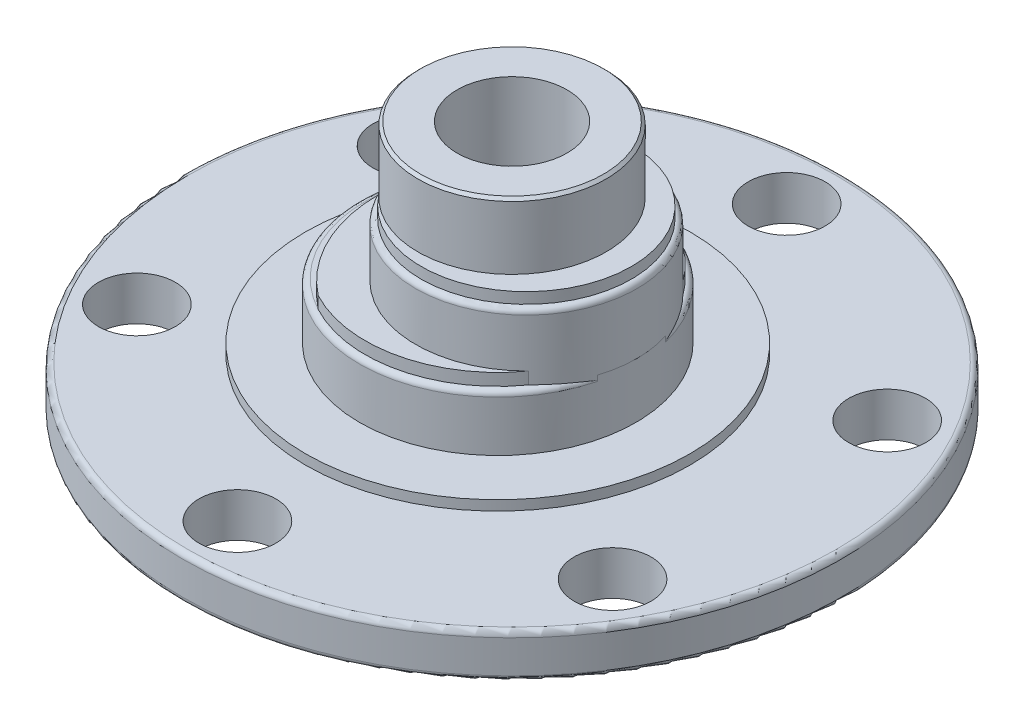
ISO-10303-21;
HEADER;
FILE_DESCRIPTION(('STEP AP214'),'2;1');
FILE_NAME('part.step','',(''),(''),'','','');
FILE_SCHEMA(('AUTOMOTIVE_DESIGN { 1 0 10303 214 1 1 1 1 }'));
ENDSEC;
DATA;
#1=APPLICATION_CONTEXT('core data for automotive mechanical design processes');
#2=APPLICATION_PROTOCOL_DEFINITION('international standard','automotive_design',2000,#1);
#3=PRODUCT_CONTEXT('',#1,'mechanical');
#4=PRODUCT('Part','Part','',(#3));
#5=PRODUCT_RELATED_PRODUCT_CATEGORY('part','',(#4));
#6=PRODUCT_DEFINITION_FORMATION('','',#4);
#7=PRODUCT_DEFINITION_CONTEXT('part definition',#1,'design');
#8=PRODUCT_DEFINITION('design','',#6,#7);
#9=PRODUCT_DEFINITION_SHAPE('','',#8);
#10=(LENGTH_UNIT() NAMED_UNIT(*) SI_UNIT(.MILLI.,.METRE.));
#11=(NAMED_UNIT(*) PLANE_ANGLE_UNIT() SI_UNIT($,.RADIAN.));
#12=(NAMED_UNIT(*) SI_UNIT($,.STERADIAN.) SOLID_ANGLE_UNIT());
#13=UNCERTAINTY_MEASURE_WITH_UNIT(LENGTH_MEASURE(1.E-05),#10,'distance_accuracy_value','');
#14=(GEOMETRIC_REPRESENTATION_CONTEXT(3) GLOBAL_UNCERTAINTY_ASSIGNED_CONTEXT((#13)) GLOBAL_UNIT_ASSIGNED_CONTEXT((#10,
#11,#12)) REPRESENTATION_CONTEXT('',''));
#15=CARTESIAN_POINT('',(0.,0.,0.));
#16=DIRECTION('',(0.,0.,1.));
#17=DIRECTION('',(1.,0.,0.));
#18=AXIS2_PLACEMENT_3D('',#15,#16,#17);
#19=CARTESIAN_POINT('',(0.,-0.001000000000001,0.));
#20=DIRECTION('',(0.,1.,0.));
#21=DIRECTION('',(0.,0.,1.));
#22=AXIS2_PLACEMENT_3D('',#19,#20,#21);
#23=CYLINDRICAL_SURFACE('',#22,5.);
#24=CARTESIAN_POINT('',(0.,23.,0.));
#25=DIRECTION('',(0.,1.,0.));
#26=DIRECTION('',(0.,0.,1.));
#27=AXIS2_PLACEMENT_3D('',#24,#25,#26);
#28=CIRCLE('',#27,5.);
#29=CARTESIAN_POINT('',(0.,23.,5.));
#30=VERTEX_POINT('',#29);
#31=EDGE_CURVE('E118',#30,#30,#28,.T.);
#32=ORIENTED_EDGE('',*,*,#31,.T.);
#33=EDGE_LOOP('',(#32));
#34=FACE_BOUND('',#33,.T.);
#35=CARTESIAN_POINT('',(0.,7.,0.));
#36=DIRECTION('',(0.,-1.,0.));
#37=DIRECTION('',(0.,0.,-1.));
#38=AXIS2_PLACEMENT_3D('',#35,#36,#37);
#39=CIRCLE('',#38,5.);
#40=CARTESIAN_POINT('',(0.,7.,-5.));
#41=VERTEX_POINT('',#40);
#42=EDGE_CURVE('E46',#41,#41,#39,.F.);
#43=ORIENTED_EDGE('',*,*,#42,.F.);
#44=EDGE_LOOP('',(#43));
#45=FACE_BOUND('',#44,.T.);
#46=ADVANCED_FACE('F41',(#34,#45),#23,.F.);
#47=CARTESIAN_POINT('',(0.,23.,0.));
#48=DIRECTION('',(0.,-1.,0.));
#49=DIRECTION('',(0.,0.,-1.));
#50=AXIS2_PLACEMENT_3D('',#47,#48,#49);
#51=CYLINDRICAL_SURFACE('',#50,8.575);
#52=CARTESIAN_POINT('',(0.,22.75,0.));
#53=DIRECTION('',(0.,1.,0.));
#54=DIRECTION('',(0.,0.,1.));
#55=AXIS2_PLACEMENT_3D('',#52,#53,#54);
#56=CIRCLE('',#55,8.575);
#57=CARTESIAN_POINT('',(0.,22.75,8.575));
#58=VERTEX_POINT('',#57);
#59=EDGE_CURVE('E11',#58,#58,#56,.F.);
#60=ORIENTED_EDGE('',*,*,#59,.T.);
#61=EDGE_LOOP('',(#60));
#62=FACE_BOUND('',#61,.T.);
#63=DIRECTION('',(0.,-1.,0.));
#64=VECTOR('',#63,1.);
#65=CARTESIAN_POINT('',(-6.33076923076923,17.,5.7837691816622));
#66=LINE('',#65,#64);
#67=CARTESIAN_POINT('',(-6.33076923076923,17.,5.7837691816622));
#68=VERTEX_POINT('',#67);
#69=CARTESIAN_POINT('',(-6.33076923076923,16.,5.7837691816622));
#70=VERTEX_POINT('',#69);
#71=EDGE_CURVE('E110',#68,#70,#66,.T.);
#72=ORIENTED_EDGE('',*,*,#71,.F.);
#73=CARTESIAN_POINT('',(0.,17.,0.));
#74=DIRECTION('',(0.,1.,0.));
#75=DIRECTION('',(0.,0.,1.));
#76=AXIS2_PLACEMENT_3D('',#73,#74,#75);
#77=CIRCLE('',#76,8.575);
#78=CARTESIAN_POINT('',(-6.33076923076924,17.,-5.7837691816622));
#79=VERTEX_POINT('',#78);
#80=EDGE_CURVE('E114',#79,#68,#77,.F.);
#81=ORIENTED_EDGE('',*,*,#80,.F.);
#82=DIRECTION('',(0.,-1.,0.));
#83=VECTOR('',#82,1.);
#84=CARTESIAN_POINT('',(-6.33076923076924,17.,-5.7837691816622));
#85=LINE('',#84,#83);
#86=CARTESIAN_POINT('',(-6.33076923076924,16.,-5.7837691816622));
#87=VERTEX_POINT('',#86);
#88=EDGE_CURVE('E58',#79,#87,#85,.T.);
#89=ORIENTED_EDGE('',*,*,#88,.T.);
#90=CARTESIAN_POINT('',(0.,16.,0.));
#91=DIRECTION('',(0.,1.,0.));
#92=DIRECTION('',(0.,0.,1.));
#93=AXIS2_PLACEMENT_3D('',#90,#91,#92);
#94=CIRCLE('',#93,8.575);
#95=EDGE_CURVE('E123',#87,#70,#94,.T.);
#96=ORIENTED_EDGE('',*,*,#95,.T.);
#97=EDGE_LOOP('',(#72,#81,#89,#96));
#98=FACE_BOUND('',#97,.T.);
#99=ADVANCED_FACE('F121',(#62,#98),#51,.T.);
#100=CARTESIAN_POINT('',(-1.3,10.,0.));
#101=DIRECTION('',(0.,1.,0.));
#102=DIRECTION('',(0.,0.,1.));
#103=AXIS2_PLACEMENT_3D('',#100,#101,#102);
#104=PLANE('',#103);
#105=CARTESIAN_POINT('',(-1.3,10.,0.));
#106=DIRECTION('',(0.,1.,0.));
#107=DIRECTION('',(0.,0.,1.));
#108=AXIS2_PLACEMENT_3D('',#105,#106,#107);
#109=CIRCLE('',#108,12.075);
#110=CARTESIAN_POINT('',(-7.00853365384615,10.,-10.6404073476022));
#111=VERTEX_POINT('',#110);
#112=CARTESIAN_POINT('',(-7.00853365384615,10.,10.6404073476022));
#113=VERTEX_POINT('',#112);
#114=EDGE_CURVE('E184',#111,#113,#109,.T.);
#115=ORIENTED_EDGE('',*,*,#114,.T.);
#116=CARTESIAN_POINT('',(1.3,10.,0.));
#117=DIRECTION('',(0.,1.,0.));
#118=DIRECTION('',(0.,0.,1.));
#119=AXIS2_PLACEMENT_3D('',#116,#117,#118);
#120=CIRCLE('',#119,13.5);
#121=EDGE_CURVE('E124',#111,#113,#120,.T.);
#122=ORIENTED_EDGE('',*,*,#121,.F.);
#123=EDGE_LOOP('',(#115,#122));
#124=FACE_BOUND('',#123,.T.);
#125=ADVANCED_FACE('F227',(#124),#104,.T.);
#126=CARTESIAN_POINT('',(1.3,16.,0.));
#127=DIRECTION('',(0.,-1.,0.));
#128=DIRECTION('',(0.,0.,-1.));
#129=AXIS2_PLACEMENT_3D('',#126,#127,#128);
#130=CYLINDRICAL_SURFACE('',#129,10.075);
#131=CARTESIAN_POINT('',(1.3,15.5,0.));
#132=DIRECTION('',(0.,1.,0.));
#133=DIRECTION('',(0.,0.,1.));
#134=AXIS2_PLACEMENT_3D('',#131,#132,#133);
#135=CIRCLE('',#134,10.075);
#136=CARTESIAN_POINT('',(1.3,15.5,10.075));
#137=VERTEX_POINT('',#136);
#138=EDGE_CURVE('E317',#137,#137,#135,.F.);
#139=ORIENTED_EDGE('',*,*,#138,.T.);
#140=EDGE_LOOP('',(#139));
#141=FACE_BOUND('',#140,.T.);
#142=DIRECTION('',(0.,-1.,0.));
#143=VECTOR('',#142,1.);
#144=CARTESIAN_POINT('',(8.51923076923076,11.1,-7.02768326695162));
#145=LINE('',#144,#143);
#146=CARTESIAN_POINT('',(8.51923076923076,11.1,-7.02768326695163));
#147=VERTEX_POINT('',#146);
#148=CARTESIAN_POINT('',(8.51923076923076,10.,-7.02768326695162));
#149=VERTEX_POINT('',#148);
#150=EDGE_CURVE('E138',#147,#149,#145,.T.);
#151=ORIENTED_EDGE('',*,*,#150,.F.);
#152=CARTESIAN_POINT('',(1.3,11.1,0.));
#153=DIRECTION('',(0.,1.,0.));
#154=DIRECTION('',(0.,0.,1.));
#155=AXIS2_PLACEMENT_3D('',#152,#153,#154);
#156=CIRCLE('',#155,10.075);
#157=CARTESIAN_POINT('',(8.51923076923076,11.1,7.02768326695163));
#158=VERTEX_POINT('',#157);
#159=EDGE_CURVE('E66',#158,#147,#156,.F.);
#160=ORIENTED_EDGE('',*,*,#159,.F.);
#161=DIRECTION('',(0.,-1.,0.));
#162=VECTOR('',#161,1.);
#163=CARTESIAN_POINT('',(8.51923076923076,11.1,7.02768326695162));
#164=LINE('',#163,#162);
#165=CARTESIAN_POINT('',(8.51923076923076,10.,7.02768326695162));
#166=VERTEX_POINT('',#165);
#167=EDGE_CURVE('E155',#158,#166,#164,.T.);
#168=ORIENTED_EDGE('',*,*,#167,.T.);
#169=CARTESIAN_POINT('',(8.51923076923076,10.,7.02768326695162));
#170=CARTESIAN_POINT('',(8.63563651238101,9.99996840240579,6.90811227600927));
#171=CARTESIAN_POINT('',(8.7490560153952,9.99811674991958,6.78565033873242));
#172=CARTESIAN_POINT('',(8.96979034874039,9.99115908418076,6.53512233379229));
#173=CARTESIAN_POINT('',(9.07709633859021,9.98604848221663,6.40704860171197));
#174=CARTESIAN_POINT('',(9.29103186201019,9.97259039675203,6.13841764240633));
#175=CARTESIAN_POINT('',(9.39727898837565,9.9640760035583,5.99756419766097));
#176=CARTESIAN_POINT('',(9.60214213731524,9.94409120269003,5.71061613671366));
#177=CARTESIAN_POINT('',(9.70075810874781,9.93262077520733,5.56452148539644));
#178=CARTESIAN_POINT('',(9.89004390439838,9.9068159390869,5.26761343610396));
#179=CARTESIAN_POINT('',(9.98071743631666,9.892482877149,5.11680228499382));
#180=CARTESIAN_POINT('',(10.1539030971911,9.86078698486886,4.81091561727283));
#181=CARTESIAN_POINT('',(10.2364169205342,9.84342478561437,4.65584099456786));
#182=CARTESIAN_POINT('',(10.3906459609302,9.80565591221973,4.3467993919537));
#183=CARTESIAN_POINT('',(10.4626162847149,9.78536004526344,4.19294657256155));
#184=CARTESIAN_POINT('',(10.576383637185,9.74699997952875,3.93286473574408));
#185=CARTESIAN_POINT('',(10.6203899517399,9.73035104923298,3.82739344518857));
#186=CARTESIAN_POINT('',(10.6908347337709,9.69907062284657,3.65016990717227));
#187=CARTESIAN_POINT('',(10.7183210797933,9.68555275020768,3.5786419556687));
#188=CARTESIAN_POINT('',(10.7627824576872,9.66013595584503,3.45890379524099));
#189=CARTESIAN_POINT('',(10.7802625654173,9.6491463413982,3.41069519730222));
#190=CARTESIAN_POINT('',(10.8087550452799,9.62840223737437,3.3302233571116));
#191=CARTESIAN_POINT('',(10.8200260363024,9.6194035561469,3.29786065636609));
#192=CARTESIAN_POINT('',(10.8384974893217,9.60234158930111,3.2439511786947));
#193=CARTESIAN_POINT('',(10.8458428896495,9.59490577534367,3.22226820517531));
#194=CARTESIAN_POINT('',(10.8578910938233,9.5806979027815,3.18631170667969));
#195=CARTESIAN_POINT('',(10.8626962309892,9.57445708311123,3.17185959394509));
#196=CARTESIAN_POINT('',(10.8716136409103,9.56094928112489,3.14483958533209));
#197=CARTESIAN_POINT('',(10.8757494118808,9.55382442203031,3.13221891276522));
#198=CARTESIAN_POINT('',(10.880593538565,9.54275159690664,3.11734899485196));
#199=CARTESIAN_POINT('',(10.8816230668643,9.54021702615214,3.11418284936976));
#200=CARTESIAN_POINT('',(10.8835923956724,9.53480910632919,3.10811706908037));
#201=CARTESIAN_POINT('',(10.884532270936,9.53193604405174,3.10521721231176));
#202=CARTESIAN_POINT('',(10.8859610424923,9.52682104934938,3.10080301049849));
#203=CARTESIAN_POINT('',(10.8864932235483,9.5247062976435,3.09915717231022));
#204=CARTESIAN_POINT('',(10.8874619293133,9.52025523487091,3.09615910664946));
#205=CARTESIAN_POINT('',(10.8878986141614,9.51791930427914,3.09480638767598));
#206=CARTESIAN_POINT('',(10.8885335035988,9.51367881632907,3.09283866748168));
#207=CARTESIAN_POINT('',(10.8887642570633,9.51182654341614,3.09212311382008));
#208=CARTESIAN_POINT('',(10.8891287437987,9.50802565590225,3.09099260948895));
#209=CARTESIAN_POINT('',(10.8892627741906,9.50607735615517,3.09057673823831));
#210=CARTESIAN_POINT('',(10.8893958973663,9.50274534659864,3.09016363846876));
#211=CARTESIAN_POINT('',(10.8894238971405,9.50137331005707,3.09007673039275));
#212=CARTESIAN_POINT('',(10.8894230769231,9.5,3.09007929538631));
#213=B_SPLINE_CURVE_WITH_KNOTS('',3,(#169,#170,#171,#172,#173,#174,#175,#176,#177,#178,#179,
#180,#181,#182,#183,#184,#185,#186,#187,#188,#189,#190,#191,#192,#193,#194,#195,#196,#197,#198,
#199,#200,#201,#202,#203,#204,#205,#206,#207,#208,#209,#210,#211,#212),.UNSPECIFIED.,.F.,.F.,(4,
2,2,2,2,2,2,2,2,2,2,2,2,2,2,2,2,2,2,2,2,4),(0.,0.500548525736754,1.00180340169753,
1.53144331769353,2.06108678285924,2.59048166659905,3.11976638810272,3.63267625053849,
3.97903978052234,4.21241337535985,4.36969226421477,4.47595023304715,4.54808841108622,
4.59745820362828,4.64240269605963,4.65494131465971,4.66746938514612,4.67564800761867,
4.68381280823125,4.6897882827919,4.69574532238884,4.69986065024081),.UNSPECIFIED.);
#214=CARTESIAN_POINT('',(10.8894230769231,9.5,3.09007929538629));
#215=VERTEX_POINT('',#214);
#216=EDGE_CURVE('E167',#166,#215,#213,.T.);
#217=ORIENTED_EDGE('',*,*,#216,.T.);
#218=DIRECTION('',(0.,-1.,0.));
#219=VECTOR('',#218,1.);
#220=CARTESIAN_POINT('',(10.8894230769231,10.,3.09007929538632));
#221=LINE('',#220,#219);
#222=CARTESIAN_POINT('',(10.8894230769231,10.,3.09007929538632));
#223=VERTEX_POINT('',#222);
#224=EDGE_CURVE('E327',#223,#215,#221,.T.);
#225=ORIENTED_EDGE('',*,*,#224,.F.);
#226=CARTESIAN_POINT('',(1.3,10.,0.));
#227=DIRECTION('',(0.,1.,0.));
#228=DIRECTION('',(0.,0.,1.));
#229=AXIS2_PLACEMENT_3D('',#226,#227,#228);
#230=CIRCLE('',#229,10.075);
#231=CARTESIAN_POINT('',(10.8894230769231,10.,-3.09007929538632));
#232=VERTEX_POINT('',#231);
#233=EDGE_CURVE('E300',#223,#232,#230,.T.);
#234=ORIENTED_EDGE('',*,*,#233,.T.);
#235=DIRECTION('',(0.,-1.,0.));
#236=VECTOR('',#235,1.);
#237=CARTESIAN_POINT('',(10.8894230769231,9.5,-3.09007929538629));
#238=LINE('',#237,#236);
#239=CARTESIAN_POINT('',(10.8894230769231,9.5,-3.09007929538629));
#240=VERTEX_POINT('',#239);
#241=EDGE_CURVE('E321',#240,#232,#238,.F.);
#242=ORIENTED_EDGE('',*,*,#241,.F.);
#243=CARTESIAN_POINT('',(10.8894230769231,9.5,-3.09007929538629));
#244=CARTESIAN_POINT('',(10.8894249322048,9.5019818969448,-3.09007348673398));
#245=CARTESIAN_POINT('',(10.8893661661757,9.50395522795843,-3.090255908968));
#246=CARTESIAN_POINT('',(10.8891450859323,9.50781282868527,-3.09094188361185));
#247=CARTESIAN_POINT('',(10.8889841882797,9.50969794378106,-3.09144104285948));
#248=CARTESIAN_POINT('',(10.8885100858801,9.51395221065151,-3.09291125819031));
#249=CARTESIAN_POINT('',(10.888164557109,9.51628230853286,-3.09398239791875));
#250=CARTESIAN_POINT('',(10.8873646939747,9.5207467406168,-3.09646006943259));
#251=CARTESIAN_POINT('',(10.886909698842,9.52287977268286,-3.09786863780045));
#252=CARTESIAN_POINT('',(10.8855071911781,9.52869644972836,-3.10220654344997));
#253=CARTESIAN_POINT('',(10.884470510208,9.53215156151784,-3.10540855058282));
#254=CARTESIAN_POINT('',(10.8822627054831,9.53857964530535,-3.11221461600895));
#255=CARTESIAN_POINT('',(10.8810912394138,9.54155134127003,-3.11581969730637));
#256=CARTESIAN_POINT('',(10.8746408877388,9.55660329071556,-3.13562704363371));
#257=CARTESIAN_POINT('',(10.8687305053312,9.56590054230636,-3.1536287452676));
#258=CARTESIAN_POINT('',(10.8565411282958,9.5825445892523,-3.19038302673459));
#259=CARTESIAN_POINT('',(10.8502589151855,9.58986988265599,-3.209141505604));
#260=CARTESIAN_POINT('',(10.8312818321837,9.60988674711754,-3.26524293442894));
#261=CARTESIAN_POINT('',(10.8182382957637,9.62095157566858,-3.30308425409));
#262=CARTESIAN_POINT('',(10.7915378956929,9.64122881835449,-3.37904932933263));
#263=CARTESIAN_POINT('',(10.7778798204119,9.65043735759339,-3.41717350694505));
#264=CARTESIAN_POINT('',(10.7500817230532,9.6676135384846,-3.49330924770707));
#265=CARTESIAN_POINT('',(10.7359445265459,9.6755872920709,-3.53132038805611));
#266=CARTESIAN_POINT('',(10.7071729367475,9.69073289244306,-3.60726660526674));
#267=CARTESIAN_POINT('',(10.6925389966065,9.6979054457761,-3.64520171970726));
#268=CARTESIAN_POINT('',(10.6478203967205,9.71858086038547,-3.75906049281589));
#269=CARTESIAN_POINT('',(10.6169865251869,9.73120231403466,-3.83485238674732));
#270=CARTESIAN_POINT('',(10.5533907674816,9.75494463657653,-3.98586287527879));
#271=CARTESIAN_POINT('',(10.5206285971175,9.76606528348125,-4.0610813835189));
#272=CARTESIAN_POINT('',(10.4194567485746,9.79778671254994,-4.28580531599073));
#273=CARTESIAN_POINT('',(10.3482021019919,9.81672974564708,-4.43427627039218));
#274=CARTESIAN_POINT('',(10.1981539747209,9.85159815485739,-4.72819085444179));
#275=CARTESIAN_POINT('',(10.1193415473962,9.86751563203226,-4.87362570078304));
#276=CARTESIAN_POINT('',(9.95454983161595,9.89668488778021,-5.16059674434798));
#277=CARTESIAN_POINT('',(9.86857265936036,9.90993744955106,-5.30213407643567));
#278=CARTESIAN_POINT('',(9.68778288056079,9.93415199187985,-5.58384399876183));
#279=CARTESIAN_POINT('',(9.59282389716936,9.94506070438599,-5.72392724727065));
#280=CARTESIAN_POINT('',(9.39586738897331,9.96414989433707,-5.99926762137023));
#281=CARTESIAN_POINT('',(9.29386923462403,9.97233012737923,-6.13452431365504));
#282=CARTESIAN_POINT('',(9.08346427119599,9.9857241858267,-6.39935967504065));
#283=CARTESIAN_POINT('',(8.97508054595211,9.99094804970002,-6.52895616305343));
#284=CARTESIAN_POINT('',(8.75189492547963,9.99806934324116,-6.78258443465536));
#285=CARTESIAN_POINT('',(8.63709326870564,9.99996689641153,-6.90661642468206));
#286=CARTESIAN_POINT('',(8.51923076923076,10.0000000000001,-7.02768326695162));
#287=B_SPLINE_CURVE_WITH_KNOTS('',3,(#243,#244,#245,#246,#247,#248,#249,#250,#251,#252,#253,
#254,#255,#256,#257,#258,#259,#260,#261,#262,#263,#264,#265,#266,#267,#268,#269,#270,#271,#272,
#273,#274,#275,#276,#277,#278,#279,#280,#281,#282,#283,#284,#285,#286),.UNSPECIFIED.,.F.,.F.,(4,
2,2,2,2,2,2,2,2,2,2,2,2,2,2,2,2,2,2,2,2,4),(0.,0.00592265204308141,0.0117649003941377,
0.0194840019842621,0.0272509218969108,0.0416400207241195,0.0560665056966782,0.118750582417423,
0.182092758361773,0.306442272823928,0.431048731324662,0.555017211856519,0.678875491671499,
0.927194629186654,1.17555045602592,1.67259718794745,2.17092427271475,2.66910468831674,
3.17762803580895,3.68619692191221,4.19302841873562,4.69984109702013),.UNSPECIFIED.);
#288=EDGE_CURVE('E164',#240,#149,#287,.T.);
#289=ORIENTED_EDGE('',*,*,#288,.T.);
#290=EDGE_LOOP('',(#151,#160,#168,#217,#225,#234,#242,#289));
#291=FACE_BOUND('',#290,.T.);
#292=ADVANCED_FACE('F185',(#141,#291),#130,.T.);
#293=CARTESIAN_POINT('',(-1.3,10.,0.));
#294=DIRECTION('',(0.,-1.,0.));
#295=DIRECTION('',(0.,0.,-1.));
#296=AXIS2_PLACEMENT_3D('',#293,#294,#295);
#297=CYLINDRICAL_SURFACE('',#296,12.575);
#298=CARTESIAN_POINT('',(-1.3,4.9,0.));
#299=DIRECTION('',(0.,1.,0.));
#300=DIRECTION('',(0.,0.,1.));
#301=AXIS2_PLACEMENT_3D('',#298,#299,#300);
#302=CIRCLE('',#301,12.575);
#303=CARTESIAN_POINT('',(-1.3,4.9,12.575));
#304=VERTEX_POINT('',#303);
#305=EDGE_CURVE('E160',#304,#304,#302,.T.);
#306=ORIENTED_EDGE('',*,*,#305,.T.);
#307=EDGE_LOOP('',(#306));
#308=FACE_BOUND('',#307,.T.);
#309=CARTESIAN_POINT('',(-1.3,10.,0.));
#310=DIRECTION('',(0.,1.,0.));
#311=DIRECTION('',(0.,0.,1.));
#312=AXIS2_PLACEMENT_3D('',#309,#310,#311);
#313=CIRCLE('',#312,12.575);
#314=EDGE_CURVE('E302',#223,#232,#313,.T.);
#315=ORIENTED_EDGE('',*,*,#314,.F.);
#316=ORIENTED_EDGE('',*,*,#224,.T.);
#317=CARTESIAN_POINT('',(-1.3,9.5,0.));
#318=DIRECTION('',(0.,1.,0.));
#319=DIRECTION('',(0.,0.,1.));
#320=AXIS2_PLACEMENT_3D('',#317,#318,#319);
#321=CIRCLE('',#320,12.575);
#322=EDGE_CURVE('E324',#215,#240,#321,.F.);
#323=ORIENTED_EDGE('',*,*,#322,.T.);
#324=ORIENTED_EDGE('',*,*,#241,.T.);
#325=EDGE_LOOP('',(#315,#316,#323,#324));
#326=FACE_BOUND('',#325,.T.);
#327=ADVANCED_FACE('F288',(#308,#326),#297,.T.);
#328=CARTESIAN_POINT('',(1.3,10.,0.));
#329=DIRECTION('',(0.,1.,0.));
#330=DIRECTION('',(0.,0.,1.));
#331=AXIS2_PLACEMENT_3D('',#328,#329,#330);
#332=PLANE('',#331);
#333=ORIENTED_EDGE('',*,*,#233,.F.);
#334=ORIENTED_EDGE('',*,*,#314,.T.);
#335=EDGE_LOOP('',(#333,#334));
#336=FACE_BOUND('',#335,.T.);
#337=ADVANCED_FACE('F286',(#336),#332,.F.);
#338=CARTESIAN_POINT('',(1.3,15.5,0.));
#339=DIRECTION('',(0.,1.,0.));
#340=DIRECTION('',(0.,0.,1.));
#341=AXIS2_PLACEMENT_3D('',#338,#339,#340);
#342=TOROIDAL_SURFACE('',#341,9.575,0.5);
#343=ORIENTED_EDGE('',*,*,#138,.F.);
#344=EDGE_LOOP('',(#343));
#345=FACE_BOUND('',#344,.T.);
#346=CARTESIAN_POINT('',(1.3,16.,0.));
#347=DIRECTION('',(0.,1.,0.));
#348=DIRECTION('',(0.,0.,1.));
#349=AXIS2_PLACEMENT_3D('',#346,#347,#348);
#350=CIRCLE('',#349,9.575);
#351=EDGE_CURVE('E314',#87,#70,#350,.T.);
#352=ORIENTED_EDGE('',*,*,#351,.F.);
#353=EDGE_CURVE('E305',#70,#87,#350,.T.);
#354=ORIENTED_EDGE('',*,*,#353,.F.);
#355=EDGE_LOOP('',(#352,#354));
#356=FACE_BOUND('',#355,.T.);
#357=ADVANCED_FACE('F195',(#345,#356),#342,.T.);
#358=CARTESIAN_POINT('',(-1.3,9.5,0.));
#359=DIRECTION('',(0.,1.,0.));
#360=DIRECTION('',(0.,0.,1.));
#361=AXIS2_PLACEMENT_3D('',#358,#359,#360);
#362=TOROIDAL_SURFACE('',#361,12.075,0.5);
#363=ORIENTED_EDGE('',*,*,#288,.F.);
#364=ORIENTED_EDGE('',*,*,#322,.F.);
#365=ORIENTED_EDGE('',*,*,#216,.F.);
#366=CARTESIAN_POINT('',(-1.3,10.,0.));
#367=DIRECTION('',(0.,1.,0.));
#368=DIRECTION('',(0.,0.,1.));
#369=AXIS2_PLACEMENT_3D('',#366,#367,#368);
#370=CIRCLE('',#369,12.075);
#371=EDGE_CURVE('E127',#113,#166,#370,.T.);
#372=ORIENTED_EDGE('',*,*,#371,.F.);
#373=ORIENTED_EDGE('',*,*,#114,.F.);
#374=EDGE_CURVE('E145',#149,#111,#109,.T.);
#375=ORIENTED_EDGE('',*,*,#374,.F.);
#376=EDGE_LOOP('',(#363,#364,#365,#372,#373,#375));
#377=FACE_BOUND('',#376,.T.);
#378=ADVANCED_FACE('F189',(#377),#362,.T.);
#379=CARTESIAN_POINT('',(0.,23.,0.));
#380=DIRECTION('',(0.,1.,0.));
#381=DIRECTION('',(0.,0.,1.));
#382=AXIS2_PLACEMENT_3D('',#379,#380,#381);
#383=PLANE('',#382);
#384=ORIENTED_EDGE('',*,*,#31,.F.);
#385=EDGE_LOOP('',(#384));
#386=FACE_BOUND('',#385,.T.);
#387=CARTESIAN_POINT('',(0.,23.,0.));
#388=DIRECTION('',(0.,1.,0.));
#389=DIRECTION('',(0.,0.,1.));
#390=AXIS2_PLACEMENT_3D('',#387,#388,#389);
#391=CIRCLE('',#390,8.32500000000001);
#392=CARTESIAN_POINT('',(0.,23.,8.32500000000001));
#393=VERTEX_POINT('',#392);
#394=EDGE_CURVE('E51',#393,#393,#391,.T.);
#395=ORIENTED_EDGE('',*,*,#394,.T.);
#396=EDGE_LOOP('',(#395));
#397=FACE_BOUND('',#396,.T.);
#398=ADVANCED_FACE('F194',(#386,#397),#383,.T.);
#399=CARTESIAN_POINT('',(0.,16.,0.));
#400=DIRECTION('',(0.,1.,0.));
#401=DIRECTION('',(0.,0.,1.));
#402=AXIS2_PLACEMENT_3D('',#399,#400,#401);
#403=PLANE('',#402);
#404=ORIENTED_EDGE('',*,*,#351,.T.);
#405=ORIENTED_EDGE('',*,*,#95,.F.);
#406=EDGE_LOOP('',(#404,#405));
#407=FACE_BOUND('',#406,.T.);
#408=ADVANCED_FACE('F256',(#407),#403,.F.);
#409=CARTESIAN_POINT('',(-1.3,4.9,0.));
#410=DIRECTION('',(0.,1.,0.));
#411=DIRECTION('',(0.,0.,1.));
#412=AXIS2_PLACEMENT_3D('',#409,#410,#411);
#413=PLANE('',#412);
#414=CARTESIAN_POINT('',(-1.3,4.9,0.));
#415=DIRECTION('',(0.,1.,0.));
#416=DIRECTION('',(0.,0.,1.));
#417=AXIS2_PLACEMENT_3D('',#414,#415,#416);
#418=CIRCLE('',#417,17.5);
#419=CARTESIAN_POINT('',(-1.3,4.9,17.5));
#420=VERTEX_POINT('',#419);
#421=EDGE_CURVE('E367',#420,#420,#418,.T.);
#422=ORIENTED_EDGE('',*,*,#421,.T.);
#423=EDGE_LOOP('',(#422));
#424=FACE_BOUND('',#423,.T.);
#425=ORIENTED_EDGE('',*,*,#305,.F.);
#426=EDGE_LOOP('',(#425));
#427=FACE_BOUND('',#426,.T.);
#428=ADVANCED_FACE('F253',(#424,#427),#413,.T.);
#429=CARTESIAN_POINT('',(-1.3,4.9,0.));
#430=DIRECTION('',(0.,-1.,0.));
#431=DIRECTION('',(0.,0.,-1.));
#432=AXIS2_PLACEMENT_3D('',#429,#430,#431);
#433=CYLINDRICAL_SURFACE('',#432,17.5);
#434=ORIENTED_EDGE('',*,*,#421,.F.);
#435=EDGE_LOOP('',(#434));
#436=FACE_BOUND('',#435,.T.);
#437=CARTESIAN_POINT('',(-1.3,4.,0.));
#438=DIRECTION('',(0.,1.,0.));
#439=DIRECTION('',(0.,0.,1.));
#440=AXIS2_PLACEMENT_3D('',#437,#438,#439);
#441=CIRCLE('',#440,17.5);
#442=CARTESIAN_POINT('',(-1.3,4.,17.5));
#443=VERTEX_POINT('',#442);
#444=EDGE_CURVE('E365',#443,#443,#441,.T.);
#445=ORIENTED_EDGE('',*,*,#444,.T.);
#446=EDGE_LOOP('',(#445));
#447=FACE_BOUND('',#446,.T.);
#448=ADVANCED_FACE('F202',(#436,#447),#433,.T.);
#449=CARTESIAN_POINT('',(0.,0.5,0.));
#450=DIRECTION('',(0.,1.,0.));
#451=DIRECTION('',(0.,0.,1.));
#452=AXIS2_PLACEMENT_3D('',#449,#450,#451);
#453=TOROIDAL_SURFACE('',#452,29.5,0.5);
#454=CARTESIAN_POINT('',(0.,0.,0.));
#455=DIRECTION('',(0.,1.,0.));
#456=DIRECTION('',(0.,0.,1.));
#457=AXIS2_PLACEMENT_3D('',#454,#455,#456);
#458=CIRCLE('',#457,29.5);
#459=CARTESIAN_POINT('',(0.,0.,29.5));
#460=VERTEX_POINT('',#459);
#461=EDGE_CURVE('E336',#460,#460,#458,.F.);
#462=ORIENTED_EDGE('',*,*,#461,.F.);
#463=EDGE_LOOP('',(#462));
#464=FACE_BOUND('',#463,.T.);
#465=CARTESIAN_POINT('',(0.,0.5,0.));
#466=DIRECTION('',(0.,1.,0.));
#467=DIRECTION('',(0.,0.,1.));
#468=AXIS2_PLACEMENT_3D('',#465,#466,#467);
#469=CIRCLE('',#468,30.);
#470=CARTESIAN_POINT('',(0.,0.5,30.));
#471=VERTEX_POINT('',#470);
#472=EDGE_CURVE('E333',#471,#471,#469,.T.);
#473=ORIENTED_EDGE('',*,*,#472,.F.);
#474=EDGE_LOOP('',(#473));
#475=FACE_BOUND('',#474,.T.);
#476=ADVANCED_FACE('F198',(#464,#475),#453,.T.);
#477=CARTESIAN_POINT('',(0.,0.,0.));
#478=DIRECTION('',(0.,1.,0.));
#479=DIRECTION('',(0.,0.,1.));
#480=AXIS2_PLACEMENT_3D('',#477,#478,#479);
#481=PLANE('',#480);
#482=CARTESIAN_POINT('',(0.,0.,0.));
#483=DIRECTION('',(0.,-1.,0.));
#484=DIRECTION('',(0.,0.,-1.));
#485=AXIS2_PLACEMENT_3D('',#482,#483,#484);
#486=CIRCLE('',#485,10.);
#487=CARTESIAN_POINT('',(0.,0.,-10.));
#488=VERTEX_POINT('',#487);
#489=EDGE_CURVE('E636',#488,#488,#486,.T.);
#490=ORIENTED_EDGE('',*,*,#489,.F.);
#491=EDGE_LOOP('',(#490));
#492=FACE_BOUND('',#491,.T.);
#493=CARTESIAN_POINT('',(0.,0.,-25.));
#494=DIRECTION('',(0.,1.,0.));
#495=DIRECTION('',(0.,0.,1.));
#496=AXIS2_PLACEMENT_3D('',#493,#494,#495);
#497=CIRCLE('',#496,3.5);
#498=CARTESIAN_POINT('',(0.,0.,-21.5));
#499=VERTEX_POINT('',#498);
#500=EDGE_CURVE('E303',#499,#499,#497,.T.);
#501=ORIENTED_EDGE('',*,*,#500,.T.);
#502=EDGE_LOOP('',(#501));
#503=FACE_BOUND('',#502,.T.);
#504=CARTESIAN_POINT('',(-21.6506350946104,0.,-12.4999999999991));
#505=DIRECTION('',(0.,1.,0.));
#506=DIRECTION('',(0.,0.,1.));
#507=AXIS2_PLACEMENT_3D('',#504,#505,#506);
#508=CIRCLE('',#507,3.5);
#509=CARTESIAN_POINT('',(-21.6506350946104,0.,-8.99999999999906));
#510=VERTEX_POINT('',#509);
#511=EDGE_CURVE('E377',#510,#510,#508,.T.);
#512=ORIENTED_EDGE('',*,*,#511,.T.);
#513=EDGE_LOOP('',(#512));
#514=FACE_BOUND('',#513,.T.);
#515=CARTESIAN_POINT('',(-21.6506350946094,0.,12.5000000000009));
#516=DIRECTION('',(0.,1.,0.));
#517=DIRECTION('',(0.,0.,1.));
#518=AXIS2_PLACEMENT_3D('',#515,#516,#517);
#519=CIRCLE('',#518,3.5);
#520=CARTESIAN_POINT('',(-21.6506350946094,0.,16.0000000000009));
#521=VERTEX_POINT('',#520);
#522=EDGE_CURVE('E391',#521,#521,#519,.T.);
#523=ORIENTED_EDGE('',*,*,#522,.T.);
#524=EDGE_LOOP('',(#523));
#525=FACE_BOUND('',#524,.T.);
#526=CARTESIAN_POINT('',(2.1224433562867E-12,0.,25.));
#527=DIRECTION('',(0.,1.,0.));
#528=DIRECTION('',(0.,0.,1.));
#529=AXIS2_PLACEMENT_3D('',#526,#527,#528);
#530=CIRCLE('',#529,3.5);
#531=CARTESIAN_POINT('',(2.1224433562867E-12,0.,28.5));
#532=VERTEX_POINT('',#531);
#533=EDGE_CURVE('E388',#532,#532,#530,.T.);
#534=ORIENTED_EDGE('',*,*,#533,.T.);
#535=EDGE_LOOP('',(#534));
#536=FACE_BOUND('',#535,.T.);
#537=CARTESIAN_POINT('',(21.6506350946126,0.,12.4999999999991));
#538=DIRECTION('',(0.,1.,0.));
#539=DIRECTION('',(0.,0.,1.));
#540=AXIS2_PLACEMENT_3D('',#537,#538,#539);
#541=CIRCLE('',#540,3.5);
#542=CARTESIAN_POINT('',(21.6506350946126,0.,15.9999999999991));
#543=VERTEX_POINT('',#542);
#544=EDGE_CURVE('E384',#543,#543,#541,.T.);
#545=ORIENTED_EDGE('',*,*,#544,.T.);
#546=EDGE_LOOP('',(#545));
#547=FACE_BOUND('',#546,.T.);
#548=CARTESIAN_POINT('',(21.6506350946115,0.,-12.5000000000009));
#549=DIRECTION('',(0.,1.,0.));
#550=DIRECTION('',(0.,0.,1.));
#551=AXIS2_PLACEMENT_3D('',#548,#549,#550);
#552=CIRCLE('',#551,3.5);
#553=CARTESIAN_POINT('',(21.6506350946115,0.,-9.00000000000092));
#554=VERTEX_POINT('',#553);
#555=EDGE_CURVE('E376',#554,#554,#552,.T.);
#556=ORIENTED_EDGE('',*,*,#555,.T.);
#557=EDGE_LOOP('',(#556));
#558=FACE_BOUND('',#557,.T.);
#559=ORIENTED_EDGE('',*,*,#461,.T.);
#560=EDGE_LOOP('',(#559));
#561=FACE_BOUND('',#560,.T.);
#562=ADVANCED_FACE('F201',(#492,#503,#514,#525,#536,#547,#558,#561),#481,.F.);
#563=CARTESIAN_POINT('',(0.,4.,0.));
#564=DIRECTION('',(0.,-1.,0.));
#565=DIRECTION('',(0.,0.,-1.));
#566=AXIS2_PLACEMENT_3D('',#563,#564,#565);
#567=CYLINDRICAL_SURFACE('',#566,30.);
#568=ORIENTED_EDGE('',*,*,#472,.T.);
#569=EDGE_LOOP('',(#568));
#570=FACE_BOUND('',#569,.T.);
#571=CARTESIAN_POINT('',(0.,3.5,0.));
#572=DIRECTION('',(0.,1.,0.));
#573=DIRECTION('',(0.,0.,1.));
#574=AXIS2_PLACEMENT_3D('',#571,#572,#573);
#575=CIRCLE('',#574,30.);
#576=CARTESIAN_POINT('',(0.,3.5,30.));
#577=VERTEX_POINT('',#576);
#578=EDGE_CURVE('E330',#577,#577,#575,.F.);
#579=ORIENTED_EDGE('',*,*,#578,.T.);
#580=EDGE_LOOP('',(#579));
#581=FACE_BOUND('',#580,.T.);
#582=ADVANCED_FACE('F271',(#570,#581),#567,.T.);
#583=CARTESIAN_POINT('',(0.,0.,-25.));
#584=DIRECTION('',(0.,1.,0.));
#585=DIRECTION('',(0.,0.,1.));
#586=AXIS2_PLACEMENT_3D('',#583,#584,#585);
#587=CYLINDRICAL_SURFACE('',#586,3.5);
#588=ORIENTED_EDGE('',*,*,#500,.F.);
#589=EDGE_LOOP('',(#588));
#590=FACE_BOUND('',#589,.T.);
#591=CARTESIAN_POINT('',(0.,4.,-25.));
#592=DIRECTION('',(0.,1.,0.));
#593=DIRECTION('',(0.,0.,1.));
#594=AXIS2_PLACEMENT_3D('',#591,#592,#593);
#595=CIRCLE('',#594,3.5);
#596=CARTESIAN_POINT('',(0.,4.,-21.5));
#597=VERTEX_POINT('',#596);
#598=EDGE_CURVE('E308',#597,#597,#595,.T.);
#599=ORIENTED_EDGE('',*,*,#598,.T.);
#600=EDGE_LOOP('',(#599));
#601=FACE_BOUND('',#600,.T.);
#602=ADVANCED_FACE('F267',(#590,#601),#587,.F.);
#603=CARTESIAN_POINT('',(-21.6506350946104,0.,-12.4999999999991));
#604=DIRECTION('',(0.,1.,0.));
#605=DIRECTION('',(0.,0.,1.));
#606=AXIS2_PLACEMENT_3D('',#603,#604,#605);
#607=CYLINDRICAL_SURFACE('',#606,3.5);
#608=ORIENTED_EDGE('',*,*,#511,.F.);
#609=EDGE_LOOP('',(#608));
#610=FACE_BOUND('',#609,.T.);
#611=CARTESIAN_POINT('',(-21.6506350946104,4.,-12.4999999999991));
#612=DIRECTION('',(0.,1.,0.));
#613=DIRECTION('',(0.,0.,1.));
#614=AXIS2_PLACEMENT_3D('',#611,#612,#613);
#615=CIRCLE('',#614,3.5);
#616=CARTESIAN_POINT('',(-21.6506350946104,4.,-8.99999999999906));
#617=VERTEX_POINT('',#616);
#618=EDGE_CURVE('E359',#617,#617,#615,.T.);
#619=ORIENTED_EDGE('',*,*,#618,.T.);
#620=EDGE_LOOP('',(#619));
#621=FACE_BOUND('',#620,.T.);
#622=ADVANCED_FACE('F270',(#610,#621),#607,.F.);
#623=CARTESIAN_POINT('',(-21.6506350946094,0.,12.5000000000009));
#624=DIRECTION('',(0.,1.,0.));
#625=DIRECTION('',(0.,0.,1.));
#626=AXIS2_PLACEMENT_3D('',#623,#624,#625);
#627=CYLINDRICAL_SURFACE('',#626,3.5);
#628=ORIENTED_EDGE('',*,*,#522,.F.);
#629=EDGE_LOOP('',(#628));
#630=FACE_BOUND('',#629,.T.);
#631=CARTESIAN_POINT('',(-21.6506350946094,4.,12.5000000000009));
#632=DIRECTION('',(0.,1.,0.));
#633=DIRECTION('',(0.,0.,1.));
#634=AXIS2_PLACEMENT_3D('',#631,#632,#633);
#635=CIRCLE('',#634,3.5);
#636=CARTESIAN_POINT('',(-21.6506350946094,4.,16.0000000000009));
#637=VERTEX_POINT('',#636);
#638=EDGE_CURVE('E311',#637,#637,#635,.T.);
#639=ORIENTED_EDGE('',*,*,#638,.T.);
#640=EDGE_LOOP('',(#639));
#641=FACE_BOUND('',#640,.T.);
#642=ADVANCED_FACE('F274',(#630,#641),#627,.F.);
#643=CARTESIAN_POINT('',(2.1224433562867E-12,0.,25.));
#644=DIRECTION('',(0.,1.,0.));
#645=DIRECTION('',(0.,0.,1.));
#646=AXIS2_PLACEMENT_3D('',#643,#644,#645);
#647=CYLINDRICAL_SURFACE('',#646,3.5);
#648=ORIENTED_EDGE('',*,*,#533,.F.);
#649=EDGE_LOOP('',(#648));
#650=FACE_BOUND('',#649,.T.);
#651=CARTESIAN_POINT('',(2.1224433562867E-12,4.,25.));
#652=DIRECTION('',(0.,1.,0.));
#653=DIRECTION('',(0.,0.,1.));
#654=AXIS2_PLACEMENT_3D('',#651,#652,#653);
#655=CIRCLE('',#654,3.5);
#656=CARTESIAN_POINT('',(2.1224433562867E-12,4.,28.5));
#657=VERTEX_POINT('',#656);
#658=EDGE_CURVE('E352',#657,#657,#655,.T.);
#659=ORIENTED_EDGE('',*,*,#658,.T.);
#660=EDGE_LOOP('',(#659));
#661=FACE_BOUND('',#660,.T.);
#662=ADVANCED_FACE('F279',(#650,#661),#647,.F.);
#663=CARTESIAN_POINT('',(21.6506350946126,0.,12.4999999999991));
#664=DIRECTION('',(0.,1.,0.));
#665=DIRECTION('',(0.,0.,1.));
#666=AXIS2_PLACEMENT_3D('',#663,#664,#665);
#667=CYLINDRICAL_SURFACE('',#666,3.5);
#668=ORIENTED_EDGE('',*,*,#544,.F.);
#669=EDGE_LOOP('',(#668));
#670=FACE_BOUND('',#669,.T.);
#671=CARTESIAN_POINT('',(21.6506350946126,4.,12.4999999999991));
#672=DIRECTION('',(0.,1.,0.));
#673=DIRECTION('',(0.,0.,1.));
#674=AXIS2_PLACEMENT_3D('',#671,#672,#673);
#675=CIRCLE('',#674,3.5);
#676=CARTESIAN_POINT('',(21.6506350946126,4.,15.9999999999991));
#677=VERTEX_POINT('',#676);
#678=EDGE_CURVE('E348',#677,#677,#675,.T.);
#679=ORIENTED_EDGE('',*,*,#678,.T.);
#680=EDGE_LOOP('',(#679));
#681=FACE_BOUND('',#680,.T.);
#682=ADVANCED_FACE('F216',(#670,#681),#667,.F.);
#683=CARTESIAN_POINT('',(21.6506350946115,0.,-12.5000000000009));
#684=DIRECTION('',(0.,1.,0.));
#685=DIRECTION('',(0.,0.,1.));
#686=AXIS2_PLACEMENT_3D('',#683,#684,#685);
#687=CYLINDRICAL_SURFACE('',#686,3.5);
#688=ORIENTED_EDGE('',*,*,#555,.F.);
#689=EDGE_LOOP('',(#688));
#690=FACE_BOUND('',#689,.T.);
#691=CARTESIAN_POINT('',(21.6506350946115,4.,-12.5000000000009));
#692=DIRECTION('',(0.,1.,0.));
#693=DIRECTION('',(0.,0.,1.));
#694=AXIS2_PLACEMENT_3D('',#691,#692,#693);
#695=CIRCLE('',#694,3.5);
#696=CARTESIAN_POINT('',(21.6506350946115,4.,-9.00000000000092));
#697=VERTEX_POINT('',#696);
#698=EDGE_CURVE('E344',#697,#697,#695,.T.);
#699=ORIENTED_EDGE('',*,*,#698,.T.);
#700=EDGE_LOOP('',(#699));
#701=FACE_BOUND('',#700,.T.);
#702=ADVANCED_FACE('F207',(#690,#701),#687,.F.);
#703=CARTESIAN_POINT('',(0.,3.5,0.));
#704=DIRECTION('',(0.,1.,0.));
#705=DIRECTION('',(0.,0.,1.));
#706=AXIS2_PLACEMENT_3D('',#703,#704,#705);
#707=TOROIDAL_SURFACE('',#706,29.5,0.5);
#708=ORIENTED_EDGE('',*,*,#578,.F.);
#709=EDGE_LOOP('',(#708));
#710=FACE_BOUND('',#709,.T.);
#711=CARTESIAN_POINT('',(0.,4.,0.));
#712=DIRECTION('',(0.,1.,0.));
#713=DIRECTION('',(0.,0.,1.));
#714=AXIS2_PLACEMENT_3D('',#711,#712,#713);
#715=CIRCLE('',#714,29.5);
#716=CARTESIAN_POINT('',(0.,4.,29.5));
#717=VERTEX_POINT('',#716);
#718=EDGE_CURVE('E171',#717,#717,#715,.T.);
#719=ORIENTED_EDGE('',*,*,#718,.F.);
#720=EDGE_LOOP('',(#719));
#721=FACE_BOUND('',#720,.T.);
#722=ADVANCED_FACE('F204',(#710,#721),#707,.T.);
#723=CARTESIAN_POINT('',(0.,4.,0.));
#724=DIRECTION('',(0.,1.,0.));
#725=DIRECTION('',(0.,0.,1.));
#726=AXIS2_PLACEMENT_3D('',#723,#724,#725);
#727=PLANE('',#726);
#728=ORIENTED_EDGE('',*,*,#718,.T.);
#729=EDGE_LOOP('',(#728));
#730=FACE_BOUND('',#729,.T.);
#731=ORIENTED_EDGE('',*,*,#698,.F.);
#732=EDGE_LOOP('',(#731));
#733=FACE_BOUND('',#732,.T.);
#734=ORIENTED_EDGE('',*,*,#678,.F.);
#735=EDGE_LOOP('',(#734));
#736=FACE_BOUND('',#735,.T.);
#737=ORIENTED_EDGE('',*,*,#658,.F.);
#738=EDGE_LOOP('',(#737));
#739=FACE_BOUND('',#738,.T.);
#740=ORIENTED_EDGE('',*,*,#638,.F.);
#741=EDGE_LOOP('',(#740));
#742=FACE_BOUND('',#741,.T.);
#743=ORIENTED_EDGE('',*,*,#618,.F.);
#744=EDGE_LOOP('',(#743));
#745=FACE_BOUND('',#744,.T.);
#746=ORIENTED_EDGE('',*,*,#598,.F.);
#747=EDGE_LOOP('',(#746));
#748=FACE_BOUND('',#747,.T.);
#749=ORIENTED_EDGE('',*,*,#444,.F.);
#750=EDGE_LOOP('',(#749));
#751=FACE_BOUND('',#750,.T.);
#752=ADVANCED_FACE('F206',(#730,#733,#736,#739,#742,#745,#748,#751),#727,.T.);
#753=CARTESIAN_POINT('',(-1.3,11.1,0.));
#754=DIRECTION('',(0.,-1.,0.));
#755=DIRECTION('',(0.,0.,-1.));
#756=AXIS2_PLACEMENT_3D('',#753,#754,#755);
#757=CYLINDRICAL_SURFACE('',#756,12.075);
#758=ORIENTED_EDGE('',*,*,#374,.T.);
#759=DIRECTION('',(0.,-1.,0.));
#760=VECTOR('',#759,1.);
#761=CARTESIAN_POINT('',(-7.00853365384615,11.1,-10.6404073476022));
#762=LINE('',#761,#760);
#763=CARTESIAN_POINT('',(-7.00853365384615,11.1,-10.6404073476022));
#764=VERTEX_POINT('',#763);
#765=EDGE_CURVE('E154',#764,#111,#762,.T.);
#766=ORIENTED_EDGE('',*,*,#765,.F.);
#767=CARTESIAN_POINT('',(-1.3,11.1,0.));
#768=DIRECTION('',(0.,1.,0.));
#769=DIRECTION('',(0.,0.,1.));
#770=AXIS2_PLACEMENT_3D('',#767,#768,#769);
#771=CIRCLE('',#770,12.075);
#772=EDGE_CURVE('E131',#147,#764,#771,.T.);
#773=ORIENTED_EDGE('',*,*,#772,.F.);
#774=ORIENTED_EDGE('',*,*,#150,.T.);
#775=EDGE_LOOP('',(#758,#766,#773,#774));
#776=FACE_BOUND('',#775,.T.);
#777=ADVANCED_FACE('F213',(#776),#757,.T.);
#778=CARTESIAN_POINT('',(1.3,11.1,0.));
#779=DIRECTION('',(0.,-1.,0.));
#780=DIRECTION('',(0.,0.,-1.));
#781=AXIS2_PLACEMENT_3D('',#778,#779,#780);
#782=CYLINDRICAL_SURFACE('',#781,13.5);
#783=ORIENTED_EDGE('',*,*,#121,.T.);
#784=DIRECTION('',(0.,-1.,0.));
#785=VECTOR('',#784,1.);
#786=CARTESIAN_POINT('',(-7.00853365384615,11.1,10.6404073476022));
#787=LINE('',#786,#785);
#788=CARTESIAN_POINT('',(-7.00853365384615,11.1,10.6404073476022));
#789=VERTEX_POINT('',#788);
#790=EDGE_CURVE('E151',#789,#113,#787,.T.);
#791=ORIENTED_EDGE('',*,*,#790,.F.);
#792=CARTESIAN_POINT('',(1.3,11.1,0.));
#793=DIRECTION('',(0.,1.,0.));
#794=DIRECTION('',(0.,0.,1.));
#795=AXIS2_PLACEMENT_3D('',#792,#793,#794);
#796=CIRCLE('',#795,13.5);
#797=EDGE_CURVE('E134',#764,#789,#796,.T.);
#798=ORIENTED_EDGE('',*,*,#797,.F.);
#799=ORIENTED_EDGE('',*,*,#765,.T.);
#800=EDGE_LOOP('',(#783,#791,#798,#799));
#801=FACE_BOUND('',#800,.T.);
#802=ADVANCED_FACE('F248',(#801),#782,.T.);
#803=ORIENTED_EDGE('',*,*,#371,.T.);
#804=ORIENTED_EDGE('',*,*,#167,.F.);
#805=EDGE_CURVE('E135',#789,#158,#771,.T.);
#806=ORIENTED_EDGE('',*,*,#805,.F.);
#807=ORIENTED_EDGE('',*,*,#790,.T.);
#808=EDGE_LOOP('',(#803,#804,#806,#807));
#809=FACE_BOUND('',#808,.T.);
#810=ADVANCED_FACE('F244',(#809),#757,.T.);
#811=CARTESIAN_POINT('',(0.,11.1,0.));
#812=DIRECTION('',(0.,1.,0.));
#813=DIRECTION('',(0.,0.,1.));
#814=AXIS2_PLACEMENT_3D('',#811,#812,#813);
#815=PLANE('',#814);
#816=ORIENTED_EDGE('',*,*,#772,.T.);
#817=ORIENTED_EDGE('',*,*,#797,.T.);
#818=ORIENTED_EDGE('',*,*,#805,.T.);
#819=ORIENTED_EDGE('',*,*,#159,.T.);
#820=EDGE_LOOP('',(#816,#817,#818,#819));
#821=FACE_BOUND('',#820,.T.);
#822=ADVANCED_FACE('F241',(#821),#815,.T.);
#823=CARTESIAN_POINT('',(0.,23.,0.));
#824=DIRECTION('',(0.,-1.,0.));
#825=DIRECTION('',(0.,0.,-1.));
#826=AXIS2_PLACEMENT_3D('',#823,#824,#825);
#827=CONICAL_SURFACE('',#826,8.32500000000001,0.785398163397448);
#828=ORIENTED_EDGE('',*,*,#59,.F.);
#829=EDGE_LOOP('',(#828));
#830=FACE_BOUND('',#829,.T.);
#831=ORIENTED_EDGE('',*,*,#394,.F.);
#832=EDGE_LOOP('',(#831));
#833=FACE_BOUND('',#832,.T.);
#834=ADVANCED_FACE('F44',(#830,#833),#827,.T.);
#835=CARTESIAN_POINT('',(1.3,17.,0.));
#836=DIRECTION('',(0.,-1.,0.));
#837=DIRECTION('',(0.,0.,-1.));
#838=AXIS2_PLACEMENT_3D('',#835,#836,#837);
#839=CYLINDRICAL_SURFACE('',#838,9.575);
#840=ORIENTED_EDGE('',*,*,#353,.T.);
#841=ORIENTED_EDGE('',*,*,#88,.F.);
#842=CARTESIAN_POINT('',(1.3,17.,0.));
#843=DIRECTION('',(0.,1.,0.));
#844=DIRECTION('',(0.,0.,1.));
#845=AXIS2_PLACEMENT_3D('',#842,#843,#844);
#846=CIRCLE('',#845,9.575);
#847=EDGE_CURVE('E106',#68,#79,#846,.T.);
#848=ORIENTED_EDGE('',*,*,#847,.F.);
#849=ORIENTED_EDGE('',*,*,#71,.T.);
#850=EDGE_LOOP('',(#840,#841,#848,#849));
#851=FACE_BOUND('',#850,.T.);
#852=ADVANCED_FACE('F108',(#851),#839,.T.);
#853=CARTESIAN_POINT('',(0.,17.,0.));
#854=DIRECTION('',(0.,1.,0.));
#855=DIRECTION('',(0.,0.,1.));
#856=AXIS2_PLACEMENT_3D('',#853,#854,#855);
#857=PLANE('',#856);
#858=ORIENTED_EDGE('',*,*,#80,.T.);
#859=ORIENTED_EDGE('',*,*,#847,.T.);
#860=EDGE_LOOP('',(#858,#859));
#861=FACE_BOUND('',#860,.T.);
#862=ADVANCED_FACE('F116',(#861),#857,.T.);
#863=CARTESIAN_POINT('',(0.,7.,0.));
#864=DIRECTION('',(0.,-1.,0.));
#865=DIRECTION('',(0.,0.,-1.));
#866=AXIS2_PLACEMENT_3D('',#863,#864,#865);
#867=PLANE('',#866);
#868=CARTESIAN_POINT('',(0.,7.,0.));
#869=DIRECTION('',(0.,-1.,0.));
#870=DIRECTION('',(0.,0.,-1.));
#871=AXIS2_PLACEMENT_3D('',#868,#869,#870);
#872=CIRCLE('',#871,10.);
#873=CARTESIAN_POINT('',(0.,7.,-10.));
#874=VERTEX_POINT('',#873);
#875=EDGE_CURVE('E633',#874,#874,#872,.T.);
#876=ORIENTED_EDGE('',*,*,#875,.T.);
#877=EDGE_LOOP('',(#876));
#878=FACE_BOUND('',#877,.T.);
#879=ORIENTED_EDGE('',*,*,#42,.T.);
#880=EDGE_LOOP('',(#879));
#881=FACE_BOUND('',#880,.T.);
#882=ADVANCED_FACE('F238',(#878,#881),#867,.T.);
#883=CARTESIAN_POINT('',(0.,7.,0.));
#884=DIRECTION('',(0.,-1.,0.));
#885=DIRECTION('',(0.,0.,-1.));
#886=AXIS2_PLACEMENT_3D('',#883,#884,#885);
#887=CYLINDRICAL_SURFACE('',#886,10.);
#888=ORIENTED_EDGE('',*,*,#875,.F.);
#889=EDGE_LOOP('',(#888));
#890=FACE_BOUND('',#889,.T.);
#891=ORIENTED_EDGE('',*,*,#489,.T.);
#892=EDGE_LOOP('',(#891));
#893=FACE_BOUND('',#892,.T.);
#894=ADVANCED_FACE('F234',(#890,#893),#887,.F.);
#895=CLOSED_SHELL('',(#46,#99,#125,#292,#327,#337,#357,#378,#398,#408,#428,#448,#476,#562,#582,
#602,#622,#642,#662,#682,#702,#722,#752,#777,#802,#810,#822,#834,#852,#862,#882,#894));
#896=MANIFOLD_SOLID_BREP('B2',#895);
#897=ADVANCED_BREP_SHAPE_REPRESENTATION('',(#18,#896),#14);
#898=SHAPE_DEFINITION_REPRESENTATION(#9,#897);
ENDSEC;
END-ISO-10303-21;
